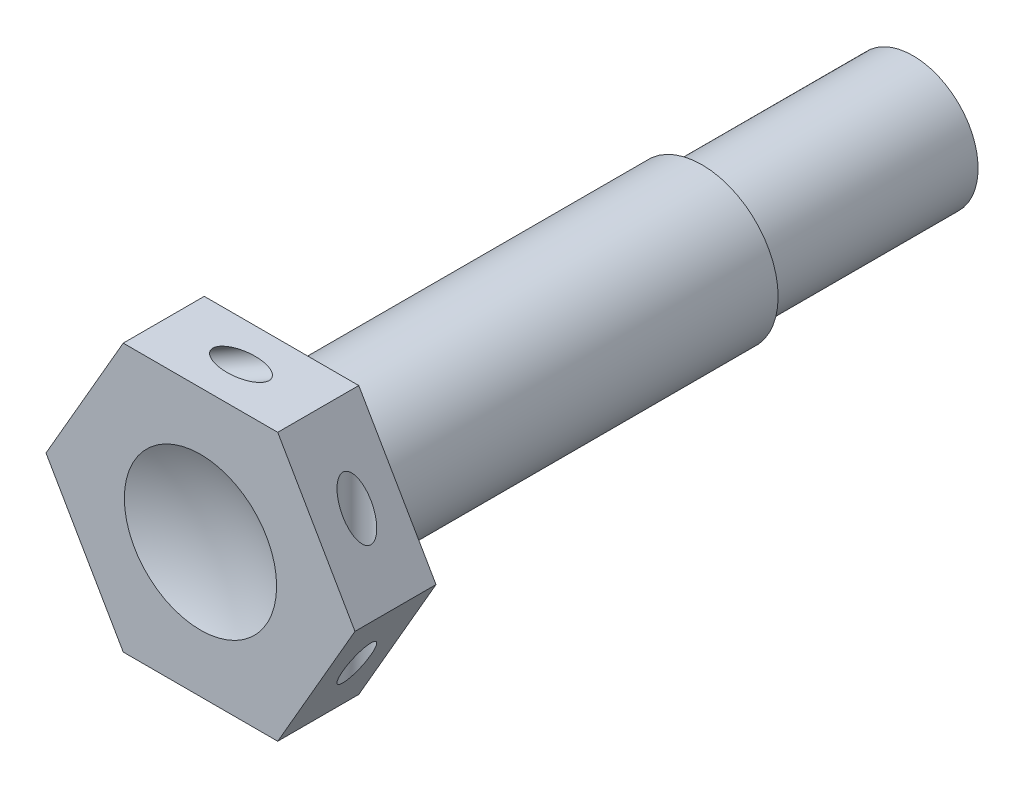
ISO-10303-21;
HEADER;
FILE_DESCRIPTION(('STEP AP214'),'2;1');
FILE_NAME('part.step','',(''),(''),'','','');
FILE_SCHEMA(('AUTOMOTIVE_DESIGN { 1 0 10303 214 1 1 1 1 }'));
ENDSEC;
DATA;
#1=APPLICATION_CONTEXT('core data for automotive mechanical design processes');
#2=APPLICATION_PROTOCOL_DEFINITION('international standard','automotive_design',2000,#1);
#3=PRODUCT_CONTEXT('',#1,'mechanical');
#4=PRODUCT('Part','Part','',(#3));
#5=PRODUCT_RELATED_PRODUCT_CATEGORY('part','',(#4));
#6=PRODUCT_DEFINITION_FORMATION('','',#4);
#7=PRODUCT_DEFINITION_CONTEXT('part definition',#1,'design');
#8=PRODUCT_DEFINITION('design','',#6,#7);
#9=PRODUCT_DEFINITION_SHAPE('','',#8);
#10=(LENGTH_UNIT() NAMED_UNIT(*) SI_UNIT(.MILLI.,.METRE.));
#11=(NAMED_UNIT(*) PLANE_ANGLE_UNIT() SI_UNIT($,.RADIAN.));
#12=(NAMED_UNIT(*) SI_UNIT($,.STERADIAN.) SOLID_ANGLE_UNIT());
#13=UNCERTAINTY_MEASURE_WITH_UNIT(LENGTH_MEASURE(1.E-05),#10,'distance_accuracy_value','');
#14=(GEOMETRIC_REPRESENTATION_CONTEXT(3) GLOBAL_UNCERTAINTY_ASSIGNED_CONTEXT((#13)) GLOBAL_UNIT_ASSIGNED_CONTEXT((#10,
#11,#12)) REPRESENTATION_CONTEXT('',''));
#15=CARTESIAN_POINT('',(0.,0.,0.));
#16=DIRECTION('',(0.,0.,1.));
#17=DIRECTION('',(1.,0.,0.));
#18=AXIS2_PLACEMENT_3D('',#15,#16,#17);
#19=CARTESIAN_POINT('',(6.41580486636972,0.,3.3655));
#20=DIRECTION('',(-0.866025403784438,-0.5,0.));
#21=DIRECTION('',(0.5,-0.866025403784439,0.));
#22=AXIS2_PLACEMENT_3D('',#19,#20,#21);
#23=PLANE('',#22);
#24=CARTESIAN_POINT('',(4.81185364977729,2.778125,1.68275));
#25=DIRECTION('',(-0.866025403784438,-0.5,0.));
#26=DIRECTION('',(-0.5,0.866025403784439,0.));
#27=AXIS2_PLACEMENT_3D('',#24,#25,#26);
#28=ELLIPSE('',#27,1.1684,0.5842);
#29=CARTESIAN_POINT('',(4.22765364977729,3.78998908178174,1.68275));
#30=VERTEX_POINT('',#29);
#31=EDGE_CURVE('E140',#30,#30,#28,.T.);
#32=ORIENTED_EDGE('',*,*,#31,.T.);
#33=EDGE_LOOP('',(#32));
#34=FACE_BOUND('',#33,.T.);
#35=DIRECTION('',(-0.5,0.866025403784438,0.));
#36=VECTOR('',#35,1.);
#37=CARTESIAN_POINT('',(6.41580486636972,0.,0.));
#38=LINE('',#37,#36);
#39=CARTESIAN_POINT('',(6.41580486636972,0.,0.));
#40=VERTEX_POINT('',#39);
#41=CARTESIAN_POINT('',(3.20790243318486,5.55625,0.));
#42=VERTEX_POINT('',#41);
#43=EDGE_CURVE('E119',#40,#42,#38,.T.);
#44=ORIENTED_EDGE('',*,*,#43,.T.);
#45=DIRECTION('',(0.,0.,-1.));
#46=VECTOR('',#45,1.);
#47=CARTESIAN_POINT('',(3.20790243318486,5.55625,3.3655));
#48=LINE('',#47,#46);
#49=CARTESIAN_POINT('',(3.20790243318486,5.55625,3.3655));
#50=VERTEX_POINT('',#49);
#51=EDGE_CURVE('E41',#50,#42,#48,.T.);
#52=ORIENTED_EDGE('',*,*,#51,.F.);
#53=DIRECTION('',(-0.5,0.866025403784438,0.));
#54=VECTOR('',#53,1.);
#55=CARTESIAN_POINT('',(6.41580486636972,0.,3.3655));
#56=LINE('',#55,#54);
#57=CARTESIAN_POINT('',(6.41580486636972,0.,3.3655));
#58=VERTEX_POINT('',#57);
#59=EDGE_CURVE('E130',#58,#50,#56,.T.);
#60=ORIENTED_EDGE('',*,*,#59,.F.);
#61=DIRECTION('',(0.,0.,-1.));
#62=VECTOR('',#61,1.);
#63=CARTESIAN_POINT('',(6.41580486636972,0.,3.3655));
#64=LINE('',#63,#62);
#65=EDGE_CURVE('E115',#58,#40,#64,.T.);
#66=ORIENTED_EDGE('',*,*,#65,.T.);
#67=EDGE_LOOP('',(#44,#52,#60,#66));
#68=FACE_BOUND('',#67,.T.);
#69=ADVANCED_FACE('F32',(#34,#68),#23,.F.);
#70=CARTESIAN_POINT('',(3.20790243318486,5.55625,3.3655));
#71=DIRECTION('',(0.,-1.,0.));
#72=DIRECTION('',(0.,0.,-1.));
#73=AXIS2_PLACEMENT_3D('',#70,#71,#72);
#74=PLANE('',#73);
#75=CARTESIAN_POINT('',(0.,5.55625,1.68275));
#76=DIRECTION('',(0.,-1.,0.));
#77=DIRECTION('',(-1.,0.,0.));
#78=AXIS2_PLACEMENT_3D('',#75,#76,#77);
#79=ELLIPSE('',#78,1.16839999999999,0.5842);
#80=CARTESIAN_POINT('',(-1.16840000000001,5.55625,1.68275));
#81=VERTEX_POINT('',#80);
#82=EDGE_CURVE('E141',#81,#81,#79,.T.);
#83=ORIENTED_EDGE('',*,*,#82,.T.);
#84=EDGE_LOOP('',(#83));
#85=FACE_BOUND('',#84,.T.);
#86=DIRECTION('',(-1.,0.,0.));
#87=VECTOR('',#86,1.);
#88=CARTESIAN_POINT('',(3.20790243318486,5.55625,0.));
#89=LINE('',#88,#87);
#90=CARTESIAN_POINT('',(-3.20790243318486,5.55625,0.));
#91=VERTEX_POINT('',#90);
#92=EDGE_CURVE('E122',#42,#91,#89,.T.);
#93=ORIENTED_EDGE('',*,*,#92,.T.);
#94=DIRECTION('',(0.,0.,-1.));
#95=VECTOR('',#94,1.);
#96=CARTESIAN_POINT('',(-3.20790243318486,5.55625,3.3655));
#97=LINE('',#96,#95);
#98=CARTESIAN_POINT('',(-3.20790243318486,5.55625,3.3655));
#99=VERTEX_POINT('',#98);
#100=EDGE_CURVE('E134',#99,#91,#97,.T.);
#101=ORIENTED_EDGE('',*,*,#100,.F.);
#102=DIRECTION('',(-1.,0.,0.));
#103=VECTOR('',#102,1.);
#104=CARTESIAN_POINT('',(3.20790243318486,5.55625,3.3655));
#105=LINE('',#104,#103);
#106=EDGE_CURVE('E88',#50,#99,#105,.T.);
#107=ORIENTED_EDGE('',*,*,#106,.F.);
#108=ORIENTED_EDGE('',*,*,#51,.T.);
#109=EDGE_LOOP('',(#93,#101,#107,#108));
#110=FACE_BOUND('',#109,.T.);
#111=ADVANCED_FACE('F171',(#85,#110),#74,.F.);
#112=CARTESIAN_POINT('',(-3.20790243318486,5.55625,3.3655));
#113=DIRECTION('',(0.866025403784439,-0.499999999999999,0.));
#114=DIRECTION('',(0.499999999999999,0.866025403784439,0.));
#115=AXIS2_PLACEMENT_3D('',#112,#113,#114);
#116=PLANE('',#115);
#117=CARTESIAN_POINT('',(-4.8118536497773,2.77812499999997,1.68275));
#118=DIRECTION('',(0.866025403784439,-0.499999999999999,0.));
#119=DIRECTION('',(-0.499999999999999,-0.866025403784439,0.));
#120=AXIS2_PLACEMENT_3D('',#117,#118,#119);
#121=ELLIPSE('',#120,1.16840000000001,0.5842);
#122=CARTESIAN_POINT('',(-5.39605364977731,1.76626091821823,1.68275));
#123=VERTEX_POINT('',#122);
#124=EDGE_CURVE('E35',#123,#123,#121,.T.);
#125=ORIENTED_EDGE('',*,*,#124,.T.);
#126=EDGE_LOOP('',(#125));
#127=FACE_BOUND('',#126,.T.);
#128=DIRECTION('',(-0.499999999999999,-0.866025403784439,0.));
#129=VECTOR('',#128,1.);
#130=CARTESIAN_POINT('',(-3.20790243318486,5.55625,0.));
#131=LINE('',#130,#129);
#132=CARTESIAN_POINT('',(-6.41580486636972,0.,0.));
#133=VERTEX_POINT('',#132);
#134=EDGE_CURVE('E125',#91,#133,#131,.T.);
#135=ORIENTED_EDGE('',*,*,#134,.T.);
#136=DIRECTION('',(0.,0.,-1.));
#137=VECTOR('',#136,1.);
#138=CARTESIAN_POINT('',(-6.41580486636972,0.,3.3655));
#139=LINE('',#138,#137);
#140=CARTESIAN_POINT('',(-6.41580486636972,0.,3.3655));
#141=VERTEX_POINT('',#140);
#142=EDGE_CURVE('E110',#141,#133,#139,.T.);
#143=ORIENTED_EDGE('',*,*,#142,.F.);
#144=DIRECTION('',(-0.499999999999999,-0.866025403784439,0.));
#145=VECTOR('',#144,1.);
#146=CARTESIAN_POINT('',(-3.20790243318486,5.55625,3.3655));
#147=LINE('',#146,#145);
#148=EDGE_CURVE('E101',#99,#141,#147,.T.);
#149=ORIENTED_EDGE('',*,*,#148,.F.);
#150=ORIENTED_EDGE('',*,*,#100,.T.);
#151=EDGE_LOOP('',(#135,#143,#149,#150));
#152=FACE_BOUND('',#151,.T.);
#153=ADVANCED_FACE('F174',(#127,#152),#116,.F.);
#154=CARTESIAN_POINT('',(-6.41580486636972,0.,3.3655));
#155=DIRECTION('',(0.866025403784438,0.5,0.));
#156=DIRECTION('',(-0.5,0.866025403784438,0.));
#157=AXIS2_PLACEMENT_3D('',#154,#155,#156);
#158=PLANE('',#157);
#159=CARTESIAN_POINT('',(-4.81185364977726,-2.77812500000004,1.68275));
#160=DIRECTION('',(0.866025403784438,0.5,0.));
#161=DIRECTION('',(0.5,-0.866025403784438,0.));
#162=AXIS2_PLACEMENT_3D('',#159,#160,#161);
#163=ELLIPSE('',#162,1.16839999999998,0.5842);
#164=CARTESIAN_POINT('',(-4.22765364977727,-3.78998908178176,1.68275));
#165=VERTEX_POINT('',#164);
#166=EDGE_CURVE('E144',#165,#165,#163,.T.);
#167=ORIENTED_EDGE('',*,*,#166,.T.);
#168=EDGE_LOOP('',(#167));
#169=FACE_BOUND('',#168,.T.);
#170=DIRECTION('',(0.5,-0.866025403784438,0.));
#171=VECTOR('',#170,1.);
#172=CARTESIAN_POINT('',(-6.41580486636972,0.,0.));
#173=LINE('',#172,#171);
#174=CARTESIAN_POINT('',(-3.20790243318486,-5.55625,0.));
#175=VERTEX_POINT('',#174);
#176=EDGE_CURVE('E109',#133,#175,#173,.T.);
#177=ORIENTED_EDGE('',*,*,#176,.T.);
#178=DIRECTION('',(0.,0.,-1.));
#179=VECTOR('',#178,1.);
#180=CARTESIAN_POINT('',(-3.20790243318486,-5.55625,3.3655));
#181=LINE('',#180,#179);
#182=CARTESIAN_POINT('',(-3.20790243318486,-5.55625,3.3655));
#183=VERTEX_POINT('',#182);
#184=EDGE_CURVE('E106',#183,#175,#181,.T.);
#185=ORIENTED_EDGE('',*,*,#184,.F.);
#186=DIRECTION('',(0.5,-0.866025403784438,0.));
#187=VECTOR('',#186,1.);
#188=CARTESIAN_POINT('',(-6.41580486636972,0.,3.3655));
#189=LINE('',#188,#187);
#190=EDGE_CURVE('E95',#141,#183,#189,.T.);
#191=ORIENTED_EDGE('',*,*,#190,.F.);
#192=ORIENTED_EDGE('',*,*,#142,.T.);
#193=EDGE_LOOP('',(#177,#185,#191,#192));
#194=FACE_BOUND('',#193,.T.);
#195=ADVANCED_FACE('F107',(#169,#194),#158,.F.);
#196=CARTESIAN_POINT('',(-3.20790243318486,-5.55625,3.3655));
#197=DIRECTION('',(0.,1.,0.));
#198=DIRECTION('',(-1.,0.,0.));
#199=AXIS2_PLACEMENT_3D('',#196,#197,#198);
#200=PLANE('',#199);
#201=CARTESIAN_POINT('',(0.,-5.55625,1.68275));
#202=DIRECTION('',(0.,1.,0.));
#203=DIRECTION('',(1.,0.,0.));
#204=AXIS2_PLACEMENT_3D('',#201,#202,#203);
#205=ELLIPSE('',#204,1.16840000000002,0.5842);
#206=CARTESIAN_POINT('',(1.16840000000008,-5.55625,1.68275));
#207=VERTEX_POINT('',#206);
#208=EDGE_CURVE('E142',#207,#207,#205,.T.);
#209=ORIENTED_EDGE('',*,*,#208,.T.);
#210=EDGE_LOOP('',(#209));
#211=FACE_BOUND('',#210,.T.);
#212=DIRECTION('',(1.,0.,0.));
#213=VECTOR('',#212,1.);
#214=CARTESIAN_POINT('',(-3.20790243318486,-5.55625,0.));
#215=LINE('',#214,#213);
#216=CARTESIAN_POINT('',(3.20790243318486,-5.55625,0.));
#217=VERTEX_POINT('',#216);
#218=EDGE_CURVE('E73',#175,#217,#215,.T.);
#219=ORIENTED_EDGE('',*,*,#218,.T.);
#220=DIRECTION('',(0.,0.,-1.));
#221=VECTOR('',#220,1.);
#222=CARTESIAN_POINT('',(3.20790243318486,-5.55625,3.3655));
#223=LINE('',#222,#221);
#224=CARTESIAN_POINT('',(3.20790243318486,-5.55625,3.3655));
#225=VERTEX_POINT('',#224);
#226=EDGE_CURVE('E111',#225,#217,#223,.T.);
#227=ORIENTED_EDGE('',*,*,#226,.F.);
#228=DIRECTION('',(1.,0.,0.));
#229=VECTOR('',#228,1.);
#230=CARTESIAN_POINT('',(-3.20790243318486,-5.55625,3.3655));
#231=LINE('',#230,#229);
#232=EDGE_CURVE('E99',#183,#225,#231,.T.);
#233=ORIENTED_EDGE('',*,*,#232,.F.);
#234=ORIENTED_EDGE('',*,*,#184,.T.);
#235=EDGE_LOOP('',(#219,#227,#233,#234));
#236=FACE_BOUND('',#235,.T.);
#237=ADVANCED_FACE('F113',(#211,#236),#200,.F.);
#238=CARTESIAN_POINT('',(3.20790243318486,-5.55625,3.3655));
#239=DIRECTION('',(-0.866025403784439,0.5,0.));
#240=DIRECTION('',(-0.5,-0.866025403784439,0.));
#241=AXIS2_PLACEMENT_3D('',#238,#239,#240);
#242=PLANE('',#241);
#243=CARTESIAN_POINT('',(4.81185364977729,-2.778125,1.68275));
#244=DIRECTION('',(-0.866025403784439,0.5,0.));
#245=DIRECTION('',(0.5,0.866025403784439,0.));
#246=AXIS2_PLACEMENT_3D('',#243,#244,#245);
#247=ELLIPSE('',#246,1.1684,0.5842);
#248=CARTESIAN_POINT('',(5.39605364977729,-1.76626091821826,1.68275));
#249=VERTEX_POINT('',#248);
#250=EDGE_CURVE('E138',#249,#249,#247,.T.);
#251=ORIENTED_EDGE('',*,*,#250,.T.);
#252=EDGE_LOOP('',(#251));
#253=FACE_BOUND('',#252,.T.);
#254=DIRECTION('',(0.5,0.866025403784439,0.));
#255=VECTOR('',#254,1.);
#256=CARTESIAN_POINT('',(3.20790243318486,-5.55625,0.));
#257=LINE('',#256,#255);
#258=EDGE_CURVE('E79',#217,#40,#257,.T.);
#259=ORIENTED_EDGE('',*,*,#258,.T.);
#260=ORIENTED_EDGE('',*,*,#65,.F.);
#261=DIRECTION('',(0.5,0.866025403784439,0.));
#262=VECTOR('',#261,1.);
#263=CARTESIAN_POINT('',(3.20790243318486,-5.55625,3.3655));
#264=LINE('',#263,#262);
#265=EDGE_CURVE('E50',#225,#58,#264,.T.);
#266=ORIENTED_EDGE('',*,*,#265,.F.);
#267=ORIENTED_EDGE('',*,*,#226,.T.);
#268=EDGE_LOOP('',(#259,#260,#266,#267));
#269=FACE_BOUND('',#268,.T.);
#270=ADVANCED_FACE('F179',(#253,#269),#242,.F.);
#271=CARTESIAN_POINT('',(0.,0.,3.3655));
#272=DIRECTION('',(0.,0.,1.));
#273=DIRECTION('',(1.,0.,0.));
#274=AXIS2_PLACEMENT_3D('',#271,#272,#273);
#275=PLANE('',#274);
#276=CARTESIAN_POINT('',(0.,0.,3.3655));
#277=DIRECTION('',(0.,0.,1.));
#278=DIRECTION('',(0.,-1.,0.));
#279=AXIS2_PLACEMENT_3D('',#276,#277,#278);
#280=CIRCLE('',#279,3.1623);
#281=CARTESIAN_POINT('',(0.,-3.1623,3.3655));
#282=VERTEX_POINT('',#281);
#283=EDGE_CURVE('E157',#282,#282,#280,.T.);
#284=ORIENTED_EDGE('',*,*,#283,.F.);
#285=EDGE_LOOP('',(#284));
#286=FACE_BOUND('',#285,.T.);
#287=ORIENTED_EDGE('',*,*,#59,.T.);
#288=ORIENTED_EDGE('',*,*,#106,.T.);
#289=ORIENTED_EDGE('',*,*,#148,.T.);
#290=ORIENTED_EDGE('',*,*,#190,.T.);
#291=ORIENTED_EDGE('',*,*,#232,.T.);
#292=ORIENTED_EDGE('',*,*,#265,.T.);
#293=EDGE_LOOP('',(#287,#288,#289,#290,#291,#292));
#294=FACE_BOUND('',#293,.T.);
#295=ADVANCED_FACE('F97',(#286,#294),#275,.T.);
#296=CARTESIAN_POINT('',(0.,0.,0.));
#297=DIRECTION('',(0.,0.,1.));
#298=DIRECTION('',(1.,0.,0.));
#299=AXIS2_PLACEMENT_3D('',#296,#297,#298);
#300=PLANE('',#299);
#301=CARTESIAN_POINT('',(0.,0.,0.));
#302=DIRECTION('',(0.,0.,1.));
#303=DIRECTION('',(1.,0.,0.));
#304=AXIS2_PLACEMENT_3D('',#301,#302,#303);
#305=CIRCLE('',#304,3.1623);
#306=CARTESIAN_POINT('',(3.1623,0.,0.));
#307=VERTEX_POINT('',#306);
#308=EDGE_CURVE('E11',#307,#307,#305,.F.);
#309=ORIENTED_EDGE('',*,*,#308,.F.);
#310=EDGE_LOOP('',(#309));
#311=FACE_BOUND('',#310,.T.);
#312=ORIENTED_EDGE('',*,*,#43,.F.);
#313=ORIENTED_EDGE('',*,*,#258,.F.);
#314=ORIENTED_EDGE('',*,*,#218,.F.);
#315=ORIENTED_EDGE('',*,*,#176,.F.);
#316=ORIENTED_EDGE('',*,*,#134,.F.);
#317=ORIENTED_EDGE('',*,*,#92,.F.);
#318=EDGE_LOOP('',(#312,#313,#314,#315,#316,#317));
#319=FACE_BOUND('',#318,.T.);
#320=ADVANCED_FACE('F177',(#311,#319),#300,.F.);
#321=CARTESIAN_POINT('',(0.,0.,-17.4625));
#322=DIRECTION('',(0.,0.,1.));
#323=DIRECTION('',(1.,0.,0.));
#324=AXIS2_PLACEMENT_3D('',#321,#322,#323);
#325=CYLINDRICAL_SURFACE('',#324,3.1623);
#326=CARTESIAN_POINT('',(0.,0.,-17.4625));
#327=DIRECTION('',(0.,0.,-1.));
#328=DIRECTION('',(-1.,0.,0.));
#329=AXIS2_PLACEMENT_3D('',#326,#327,#328);
#330=CIRCLE('',#329,3.1623);
#331=CARTESIAN_POINT('',(-3.1623,0.,-17.4625));
#332=VERTEX_POINT('',#331);
#333=EDGE_CURVE('E123',#332,#332,#330,.T.);
#334=ORIENTED_EDGE('',*,*,#333,.F.);
#335=EDGE_LOOP('',(#334));
#336=FACE_BOUND('',#335,.T.);
#337=ORIENTED_EDGE('',*,*,#308,.T.);
#338=EDGE_LOOP('',(#337));
#339=FACE_BOUND('',#338,.T.);
#340=ADVANCED_FACE('F228',(#336,#339),#325,.T.);
#341=CARTESIAN_POINT('',(0.,0.,-17.4625));
#342=DIRECTION('',(0.,0.,-1.));
#343=DIRECTION('',(-1.,0.,0.));
#344=AXIS2_PLACEMENT_3D('',#341,#342,#343);
#345=PLANE('',#344);
#346=CARTESIAN_POINT('',(0.,0.,-17.4625));
#347=DIRECTION('',(0.,0.,-1.));
#348=DIRECTION('',(-1.,0.,0.));
#349=AXIS2_PLACEMENT_3D('',#346,#347,#348);
#350=CIRCLE('',#349,2.7051);
#351=CARTESIAN_POINT('',(-2.7051,0.,-17.4625));
#352=VERTEX_POINT('',#351);
#353=EDGE_CURVE('E160',#352,#352,#350,.T.);
#354=ORIENTED_EDGE('',*,*,#353,.F.);
#355=EDGE_LOOP('',(#354));
#356=FACE_BOUND('',#355,.T.);
#357=ORIENTED_EDGE('',*,*,#333,.T.);
#358=EDGE_LOOP('',(#357));
#359=FACE_BOUND('',#358,.T.);
#360=ADVANCED_FACE('F224',(#356,#359),#345,.T.);
#361=CARTESIAN_POINT('',(0.,0.,-26.2255));
#362=DIRECTION('',(0.,0.,1.));
#363=DIRECTION('',(1.,0.,0.));
#364=AXIS2_PLACEMENT_3D('',#361,#362,#363);
#365=CYLINDRICAL_SURFACE('',#364,2.7051);
#366=CARTESIAN_POINT('',(0.,0.,-26.2255));
#367=DIRECTION('',(0.,0.,-1.));
#368=DIRECTION('',(-1.,0.,0.));
#369=AXIS2_PLACEMENT_3D('',#366,#367,#368);
#370=CIRCLE('',#369,2.7051);
#371=CARTESIAN_POINT('',(-2.7051,0.,-26.2255));
#372=VERTEX_POINT('',#371);
#373=EDGE_CURVE('E161',#372,#372,#370,.T.);
#374=ORIENTED_EDGE('',*,*,#373,.F.);
#375=EDGE_LOOP('',(#374));
#376=FACE_BOUND('',#375,.T.);
#377=ORIENTED_EDGE('',*,*,#353,.T.);
#378=EDGE_LOOP('',(#377));
#379=FACE_BOUND('',#378,.T.);
#380=ADVANCED_FACE('F220',(#376,#379),#365,.T.);
#381=CARTESIAN_POINT('',(0.,0.,-26.2255));
#382=DIRECTION('',(0.,0.,-1.));
#383=DIRECTION('',(-1.,0.,0.));
#384=AXIS2_PLACEMENT_3D('',#381,#382,#383);
#385=PLANE('',#384);
#386=ORIENTED_EDGE('',*,*,#373,.T.);
#387=EDGE_LOOP('',(#386));
#388=FACE_BOUND('',#387,.T.);
#389=ADVANCED_FACE('F212',(#388),#385,.T.);
#390=CARTESIAN_POINT('',(0.,0.,10.1470742347274));
#391=DIRECTION('',(0.,0.,1.));
#392=DIRECTION('',(0.,1.,0.));
#393=AXIS2_PLACEMENT_3D('',#390,#391,#392);
#394=SPHERICAL_SURFACE('',#393,7.48263926640312);
#395=ORIENTED_EDGE('',*,*,#283,.T.);
#396=EDGE_LOOP('',(#395));
#397=FACE_BOUND('',#396,.T.);
#398=ADVANCED_FACE('F202',(#397),#394,.F.);
#399=CARTESIAN_POINT('',(4.81185364977729,-5.55625,1.68275));
#400=DIRECTION('',(0.,1.,0.));
#401=DIRECTION('',(0.,0.,1.));
#402=AXIS2_PLACEMENT_3D('',#399,#400,#401);
#403=CYLINDRICAL_SURFACE('',#402,0.5842);
#404=ORIENTED_EDGE('',*,*,#250,.F.);
#405=EDGE_LOOP('',(#404));
#406=FACE_BOUND('',#405,.T.);
#407=ORIENTED_EDGE('',*,*,#31,.F.);
#408=EDGE_LOOP('',(#407));
#409=FACE_BOUND('',#408,.T.);
#410=ADVANCED_FACE('F199',(#406,#409),#403,.F.);
#411=CARTESIAN_POINT('',(-9.62370729955456,0.,1.68275));
#412=DIRECTION('',(0.866025403784443,-0.499999999999992,0.));
#413=DIRECTION('',(0.499999999999992,0.866025403784443,0.));
#414=AXIS2_PLACEMENT_3D('',#411,#412,#413);
#415=CYLINDRICAL_SURFACE('',#414,0.5842);
#416=ORIENTED_EDGE('',*,*,#208,.F.);
#417=EDGE_LOOP('',(#416));
#418=FACE_BOUND('',#417,.T.);
#419=ORIENTED_EDGE('',*,*,#166,.F.);
#420=EDGE_LOOP('',(#419));
#421=FACE_BOUND('',#420,.T.);
#422=ADVANCED_FACE('F201',(#418,#421),#415,.F.);
#423=CARTESIAN_POINT('',(4.81185364977725,8.33437500000002,1.68275));
#424=DIRECTION('',(-0.866025403784436,-0.500000000000004,0.));
#425=DIRECTION('',(0.500000000000004,-0.866025403784436,0.));
#426=AXIS2_PLACEMENT_3D('',#423,#424,#425);
#427=CYLINDRICAL_SURFACE('',#426,0.5842);
#428=ORIENTED_EDGE('',*,*,#124,.F.);
#429=EDGE_LOOP('',(#428));
#430=FACE_BOUND('',#429,.T.);
#431=ORIENTED_EDGE('',*,*,#82,.F.);
#432=EDGE_LOOP('',(#431));
#433=FACE_BOUND('',#432,.T.);
#434=ADVANCED_FACE('F209',(#430,#433),#427,.F.);
#435=CLOSED_SHELL('',(#69,#111,#153,#195,#237,#270,#295,#320,#340,#360,#380,#389,#398,#410,#422,#434));
#436=MANIFOLD_SOLID_BREP('B2',#435);
#437=ADVANCED_BREP_SHAPE_REPRESENTATION('',(#18,#436),#14);
#438=SHAPE_DEFINITION_REPRESENTATION(#9,#437);
ENDSEC;
END-ISO-10303-21;
